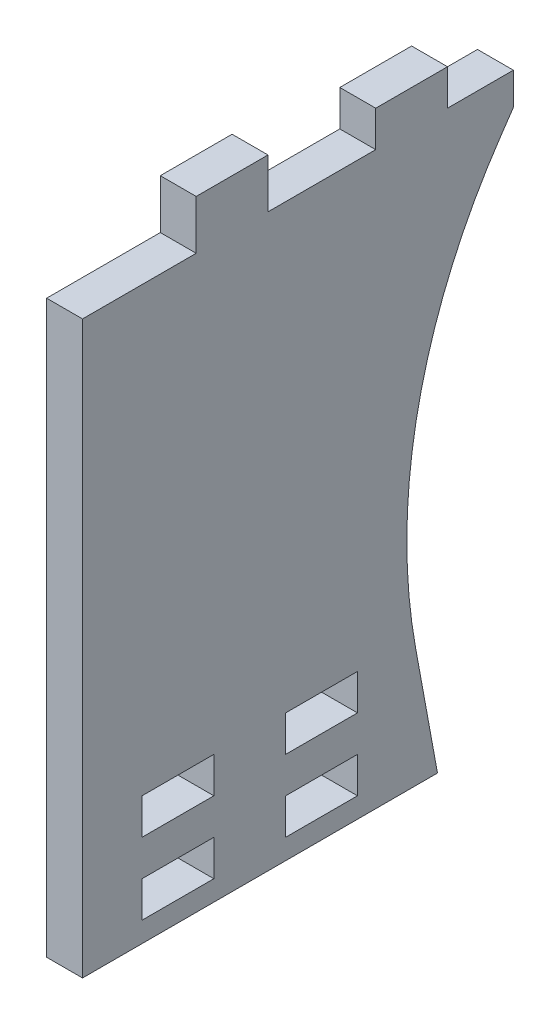
ISO-10303-21;
HEADER;
FILE_DESCRIPTION(('STEP AP214'),'2;1');
FILE_NAME('part.step','',(''),(''),'','','');
FILE_SCHEMA(('AUTOMOTIVE_DESIGN { 1 0 10303 214 1 1 1 1 }'));
ENDSEC;
DATA;
#1=APPLICATION_CONTEXT('core data for automotive mechanical design processes');
#2=APPLICATION_PROTOCOL_DEFINITION('international standard','automotive_design',2000,#1);
#3=PRODUCT_CONTEXT('',#1,'mechanical');
#4=PRODUCT('Part','Part','',(#3));
#5=PRODUCT_RELATED_PRODUCT_CATEGORY('part','',(#4));
#6=PRODUCT_DEFINITION_FORMATION('','',#4);
#7=PRODUCT_DEFINITION_CONTEXT('part definition',#1,'design');
#8=PRODUCT_DEFINITION('design','',#6,#7);
#9=PRODUCT_DEFINITION_SHAPE('','',#8);
#10=(LENGTH_UNIT() NAMED_UNIT(*) SI_UNIT(.MILLI.,.METRE.));
#11=(NAMED_UNIT(*) PLANE_ANGLE_UNIT() SI_UNIT($,.RADIAN.));
#12=(NAMED_UNIT(*) SI_UNIT($,.STERADIAN.) SOLID_ANGLE_UNIT());
#13=UNCERTAINTY_MEASURE_WITH_UNIT(LENGTH_MEASURE(1.E-05),#10,'distance_accuracy_value','');
#14=(GEOMETRIC_REPRESENTATION_CONTEXT(3) GLOBAL_UNCERTAINTY_ASSIGNED_CONTEXT((#13)) GLOBAL_UNIT_ASSIGNED_CONTEXT((#10,
#11,#12)) REPRESENTATION_CONTEXT('',''));
#15=CARTESIAN_POINT('',(0.,0.,0.));
#16=DIRECTION('',(0.,0.,1.));
#17=DIRECTION('',(1.,0.,0.));
#18=AXIS2_PLACEMENT_3D('',#15,#16,#17);
#19=CARTESIAN_POINT('',(6.,-48.8702368334802,-124.383621935254));
#20=DIRECTION('',(1.,0.,0.));
#21=DIRECTION('',(0.,0.,-1.));
#22=AXIS2_PLACEMENT_3D('',#19,#20,#21);
#23=PLANE('',#22);
#24=DIRECTION('',(0.,0.,-1.));
#25=VECTOR('',#24,1.);
#26=CARTESIAN_POINT('',(6.,-69.5861371385895,9.86311586080989));
#27=LINE('',#26,#25);
#28=CARTESIAN_POINT('',(6.,-69.5861371385895,9.86311586080989));
#29=VERTEX_POINT('',#28);
#30=CARTESIAN_POINT('',(6.,-69.5861371385895,-2.13688413919011));
#31=VERTEX_POINT('',#30);
#32=EDGE_CURVE('E276',#29,#31,#27,.T.);
#33=ORIENTED_EDGE('',*,*,#32,.F.);
#34=DIRECTION('',(0.,-1.,0.));
#35=VECTOR('',#34,1.);
#36=CARTESIAN_POINT('',(6.,-63.5861371385895,9.86311586080989));
#37=LINE('',#36,#35);
#38=CARTESIAN_POINT('',(6.,-63.5861371385895,9.86311586080989));
#39=VERTEX_POINT('',#38);
#40=EDGE_CURVE('E274',#39,#29,#37,.T.);
#41=ORIENTED_EDGE('',*,*,#40,.F.);
#42=DIRECTION('',(0.,0.,1.));
#43=VECTOR('',#42,1.);
#44=CARTESIAN_POINT('',(6.,-63.5861371385895,9.86311586080989));
#45=LINE('',#44,#43);
#46=CARTESIAN_POINT('',(6.,-63.5861371385895,-2.13688413919011));
#47=VERTEX_POINT('',#46);
#48=EDGE_CURVE('E282',#47,#39,#45,.T.);
#49=ORIENTED_EDGE('',*,*,#48,.F.);
#50=DIRECTION('',(0.,1.,0.));
#51=VECTOR('',#50,1.);
#52=CARTESIAN_POINT('',(6.,-63.5861371385895,-2.13688413919011));
#53=LINE('',#52,#51);
#54=EDGE_CURVE('E279',#31,#47,#53,.T.);
#55=ORIENTED_EDGE('',*,*,#54,.F.);
#56=EDGE_LOOP('',(#33,#41,#49,#55));
#57=FACE_BOUND('',#56,.T.);
#58=DIRECTION('',(0.,0.,-1.));
#59=VECTOR('',#58,1.);
#60=CARTESIAN_POINT('',(6.,-81.5861371385895,9.86311586080989));
#61=LINE('',#60,#59);
#62=CARTESIAN_POINT('',(6.,-81.5861371385895,9.86311586080989));
#63=VERTEX_POINT('',#62);
#64=CARTESIAN_POINT('',(6.,-81.5861371385895,-2.13688413919011));
#65=VERTEX_POINT('',#64);
#66=EDGE_CURVE('E338',#63,#65,#61,.T.);
#67=ORIENTED_EDGE('',*,*,#66,.F.);
#68=DIRECTION('',(0.,-1.,0.));
#69=VECTOR('',#68,1.);
#70=CARTESIAN_POINT('',(6.,-75.5861371385895,9.86311586080989));
#71=LINE('',#70,#69);
#72=CARTESIAN_POINT('',(6.,-75.5861371385895,9.86311586080989));
#73=VERTEX_POINT('',#72);
#74=EDGE_CURVE('E336',#73,#63,#71,.T.);
#75=ORIENTED_EDGE('',*,*,#74,.F.);
#76=DIRECTION('',(0.,0.,1.));
#77=VECTOR('',#76,1.);
#78=CARTESIAN_POINT('',(6.,-75.5861371385895,9.86311586080989));
#79=LINE('',#78,#77);
#80=CARTESIAN_POINT('',(6.,-75.5861371385895,-2.13688413919011));
#81=VERTEX_POINT('',#80);
#82=EDGE_CURVE('E344',#81,#73,#79,.T.);
#83=ORIENTED_EDGE('',*,*,#82,.F.);
#84=DIRECTION('',(0.,1.,0.));
#85=VECTOR('',#84,1.);
#86=CARTESIAN_POINT('',(6.,-75.5861371385895,-2.13688413919011));
#87=LINE('',#86,#85);
#88=EDGE_CURVE('E341',#65,#81,#87,.T.);
#89=ORIENTED_EDGE('',*,*,#88,.F.);
#90=EDGE_LOOP('',(#67,#75,#83,#89));
#91=FACE_BOUND('',#90,.T.);
#92=DIRECTION('',(0.,0.,1.));
#93=VECTOR('',#92,1.);
#94=CARTESIAN_POINT('',(6.,10.4051088489599,19.8097762628617));
#95=LINE('',#94,#93);
#96=CARTESIAN_POINT('',(6.,10.4051088489599,0.815811952861727));
#97=VERTEX_POINT('',#96);
#98=CARTESIAN_POINT('',(6.,10.4051088489599,19.8097762628617));
#99=VERTEX_POINT('',#98);
#100=EDGE_CURVE('E367',#97,#99,#95,.T.);
#101=ORIENTED_EDGE('',*,*,#100,.T.);
#102=DIRECTION('',(0.,-1.,0.));
#103=VECTOR('',#102,1.);
#104=CARTESIAN_POINT('',(6.,10.4051088489599,19.8097762628617));
#105=LINE('',#104,#103);
#106=CARTESIAN_POINT('',(6.,-84.9803808195255,19.8097762628617));
#107=VERTEX_POINT('',#106);
#108=EDGE_CURVE('E370',#99,#107,#105,.T.);
#109=ORIENTED_EDGE('',*,*,#108,.T.);
#110=DIRECTION('',(0.,0.,-1.));
#111=VECTOR('',#110,1.);
#112=CARTESIAN_POINT('',(6.,-84.9803808195255,19.8097762628617));
#113=LINE('',#112,#111);
#114=CARTESIAN_POINT('',(6.,-84.9803808195255,-39.5079732572395));
#115=VERTEX_POINT('',#114);
#116=EDGE_CURVE('E373',#107,#115,#113,.T.);
#117=ORIENTED_EDGE('',*,*,#116,.T.);
#118=DIRECTION('',(0.,0.983570031032781,0.180526989821952));
#119=VECTOR('',#118,1.);
#120=CARTESIAN_POINT('',(6.,-65.1176659174562,-35.8623191423037));
#121=LINE('',#120,#119);
#122=CARTESIAN_POINT('',(6.,-65.1176659174562,-35.8623191423037));
#123=VERTEX_POINT('',#122);
#124=EDGE_CURVE('E375',#115,#123,#121,.T.);
#125=ORIENTED_EDGE('',*,*,#124,.T.);
#126=CARTESIAN_POINT('',(6.,-48.8702368334802,-124.383621935254));
#127=DIRECTION('',(-1.,0.,0.));
#128=DIRECTION('',(0.,0.,-1.));
#129=AXIS2_PLACEMENT_3D('',#126,#127,#128);
#130=CIRCLE('',#129,90.);
#131=CARTESIAN_POINT('',(6.,1.83089749925273,-50.0237202585157));
#132=VERTEX_POINT('',#131);
#133=EDGE_CURVE('E377',#123,#132,#130,.T.);
#134=ORIENTED_EDGE('',*,*,#133,.T.);
#135=DIRECTION('',(0.,0.826221129741537,-0.563345937030363));
#136=VECTOR('',#135,1.);
#137=CARTESIAN_POINT('',(6.,5.00836064229487,-52.1902237371383));
#138=LINE('',#137,#136);
#139=CARTESIAN_POINT('',(6.,5.00836064229487,-52.1902237371383));
#140=VERTEX_POINT('',#139);
#141=EDGE_CURVE('E379',#132,#140,#138,.T.);
#142=ORIENTED_EDGE('',*,*,#141,.T.);
#143=DIRECTION('',(0.,1.,0.));
#144=VECTOR('',#143,1.);
#145=CARTESIAN_POINT('',(6.,5.00836064229487,-52.1902237371383));
#146=LINE('',#145,#144);
#147=CARTESIAN_POINT('',(6.,10.4051088489599,-52.1902237371383));
#148=VERTEX_POINT('',#147);
#149=EDGE_CURVE('E381',#140,#148,#146,.T.);
#150=ORIENTED_EDGE('',*,*,#149,.T.);
#151=DIRECTION('',(0.,0.,1.));
#152=VECTOR('',#151,1.);
#153=CARTESIAN_POINT('',(6.,10.4051088489599,-41.1841880471383));
#154=LINE('',#153,#152);
#155=CARTESIAN_POINT('',(6.,10.4051088489599,-41.1841880471383));
#156=VERTEX_POINT('',#155);
#157=EDGE_CURVE('E383',#148,#156,#154,.T.);
#158=ORIENTED_EDGE('',*,*,#157,.T.);
#159=DIRECTION('',(0.,1.,0.));
#160=VECTOR('',#159,1.);
#161=CARTESIAN_POINT('',(6.,16.4051088489599,-41.1841880471383));
#162=LINE('',#161,#160);
#163=CARTESIAN_POINT('',(6.,16.4051088489599,-41.1841880471383));
#164=VERTEX_POINT('',#163);
#165=EDGE_CURVE('E385',#156,#164,#162,.T.);
#166=ORIENTED_EDGE('',*,*,#165,.T.);
#167=DIRECTION('',(0.,0.,1.));
#168=VECTOR('',#167,1.);
#169=CARTESIAN_POINT('',(6.,16.4051088489599,-29.1841880471383));
#170=LINE('',#169,#168);
#171=CARTESIAN_POINT('',(6.,16.4051088489599,-29.1841880471383));
#172=VERTEX_POINT('',#171);
#173=EDGE_CURVE('E387',#164,#172,#170,.T.);
#174=ORIENTED_EDGE('',*,*,#173,.T.);
#175=DIRECTION('',(0.,-1.,0.));
#176=VECTOR('',#175,1.);
#177=CARTESIAN_POINT('',(6.,10.4051088489599,-29.1841880471383));
#178=LINE('',#177,#176);
#179=CARTESIAN_POINT('',(6.,10.4051088489599,-29.1841880471383));
#180=VERTEX_POINT('',#179);
#181=EDGE_CURVE('E389',#172,#180,#178,.T.);
#182=ORIENTED_EDGE('',*,*,#181,.T.);
#183=DIRECTION('',(0.,0.,1.));
#184=VECTOR('',#183,1.);
#185=CARTESIAN_POINT('',(6.,10.4051088489599,-11.1841880471383));
#186=LINE('',#185,#184);
#187=CARTESIAN_POINT('',(6.,10.4051088489599,-11.1841880471383));
#188=VERTEX_POINT('',#187);
#189=EDGE_CURVE('E391',#180,#188,#186,.T.);
#190=ORIENTED_EDGE('',*,*,#189,.T.);
#191=DIRECTION('',(0.,1.,0.));
#192=VECTOR('',#191,1.);
#193=CARTESIAN_POINT('',(6.,18.6369845499627,-11.1841880471383));
#194=LINE('',#193,#192);
#195=CARTESIAN_POINT('',(6.,18.6369845499627,-11.1841880471383));
#196=VERTEX_POINT('',#195);
#197=EDGE_CURVE('E393',#188,#196,#194,.T.);
#198=ORIENTED_EDGE('',*,*,#197,.T.);
#199=DIRECTION('',(0.,0.,1.));
#200=VECTOR('',#199,1.);
#201=CARTESIAN_POINT('',(6.,18.6369845499627,0.815811952861727));
#202=LINE('',#201,#200);
#203=CARTESIAN_POINT('',(6.,18.6369845499627,0.815811952861727));
#204=VERTEX_POINT('',#203);
#205=EDGE_CURVE('E395',#196,#204,#202,.T.);
#206=ORIENTED_EDGE('',*,*,#205,.T.);
#207=DIRECTION('',(0.,-1.,0.));
#208=VECTOR('',#207,1.);
#209=CARTESIAN_POINT('',(6.,10.4051088489599,0.815811952861727));
#210=LINE('',#209,#208);
#211=EDGE_CURVE('E397',#204,#97,#210,.T.);
#212=ORIENTED_EDGE('',*,*,#211,.T.);
#213=EDGE_LOOP('',(#101,#109,#117,#125,#134,#142,#150,#158,#166,#174,#182,#190,#198,#206,#212));
#214=FACE_BOUND('',#213,.T.);
#215=DIRECTION('',(0.,0.,-1.));
#216=VECTOR('',#215,1.);
#217=CARTESIAN_POINT('',(6.,-81.5861371385895,-14.1368841391901));
#218=LINE('',#217,#216);
#219=CARTESIAN_POINT('',(6.,-81.5861371385895,-14.1368841391901));
#220=VERTEX_POINT('',#219);
#221=CARTESIAN_POINT('',(6.,-81.5861371385895,-26.1368841391901));
#222=VERTEX_POINT('',#221);
#223=EDGE_CURVE('E307',#220,#222,#218,.T.);
#224=ORIENTED_EDGE('',*,*,#223,.F.);
#225=DIRECTION('',(0.,-1.,0.));
#226=VECTOR('',#225,1.);
#227=CARTESIAN_POINT('',(6.,-75.5861371385895,-14.1368841391901));
#228=LINE('',#227,#226);
#229=CARTESIAN_POINT('',(6.,-75.5861371385895,-14.1368841391901));
#230=VERTEX_POINT('',#229);
#231=EDGE_CURVE('E305',#230,#220,#228,.T.);
#232=ORIENTED_EDGE('',*,*,#231,.F.);
#233=DIRECTION('',(0.,0.,1.));
#234=VECTOR('',#233,1.);
#235=CARTESIAN_POINT('',(6.,-75.5861371385895,-14.1368841391901));
#236=LINE('',#235,#234);
#237=CARTESIAN_POINT('',(6.,-75.5861371385895,-26.1368841391901));
#238=VERTEX_POINT('',#237);
#239=EDGE_CURVE('E313',#238,#230,#236,.T.);
#240=ORIENTED_EDGE('',*,*,#239,.F.);
#241=DIRECTION('',(0.,1.,0.));
#242=VECTOR('',#241,1.);
#243=CARTESIAN_POINT('',(6.,-75.5861371385895,-26.1368841391901));
#244=LINE('',#243,#242);
#245=EDGE_CURVE('E310',#222,#238,#244,.T.);
#246=ORIENTED_EDGE('',*,*,#245,.F.);
#247=EDGE_LOOP('',(#224,#232,#240,#246));
#248=FACE_BOUND('',#247,.T.);
#249=DIRECTION('',(0.,0.,-1.));
#250=VECTOR('',#249,1.);
#251=CARTESIAN_POINT('',(6.,-69.5861371385895,-14.1368841391901));
#252=LINE('',#251,#250);
#253=CARTESIAN_POINT('',(6.,-69.5861371385895,-14.1368841391901));
#254=VERTEX_POINT('',#253);
#255=CARTESIAN_POINT('',(6.,-69.5861371385895,-26.1368841391901));
#256=VERTEX_POINT('',#255);
#257=EDGE_CURVE('E246',#254,#256,#252,.T.);
#258=ORIENTED_EDGE('',*,*,#257,.F.);
#259=DIRECTION('',(0.,-1.,0.));
#260=VECTOR('',#259,1.);
#261=CARTESIAN_POINT('',(6.,-63.5861371385895,-14.1368841391901));
#262=LINE('',#261,#260);
#263=CARTESIAN_POINT('',(6.,-63.5861371385895,-14.1368841391901));
#264=VERTEX_POINT('',#263);
#265=EDGE_CURVE('E238',#264,#254,#262,.T.);
#266=ORIENTED_EDGE('',*,*,#265,.F.);
#267=DIRECTION('',(0.,0.,1.));
#268=VECTOR('',#267,1.);
#269=CARTESIAN_POINT('',(6.,-63.5861371385895,-14.1368841391901));
#270=LINE('',#269,#268);
#271=CARTESIAN_POINT('',(6.,-63.5861371385895,-26.1368841391901));
#272=VERTEX_POINT('',#271);
#273=EDGE_CURVE('E260',#272,#264,#270,.T.);
#274=ORIENTED_EDGE('',*,*,#273,.F.);
#275=DIRECTION('',(0.,1.,0.));
#276=VECTOR('',#275,1.);
#277=CARTESIAN_POINT('',(6.,-63.5861371385895,-26.1368841391901));
#278=LINE('',#277,#276);
#279=EDGE_CURVE('E258',#256,#272,#278,.T.);
#280=ORIENTED_EDGE('',*,*,#279,.F.);
#281=EDGE_LOOP('',(#258,#266,#274,#280));
#282=FACE_BOUND('',#281,.T.);
#283=ADVANCED_FACE('F35',(#57,#91,#214,#248,#282),#23,.T.);
#284=CARTESIAN_POINT('',(0.,-48.8702368334802,-124.383621935254));
#285=DIRECTION('',(1.,0.,0.));
#286=DIRECTION('',(0.,0.,-1.));
#287=AXIS2_PLACEMENT_3D('',#284,#285,#286);
#288=PLANE('',#287);
#289=DIRECTION('',(0.,-1.,0.));
#290=VECTOR('',#289,1.);
#291=CARTESIAN_POINT('',(0.,-63.5861371385895,9.86311586080989));
#292=LINE('',#291,#290);
#293=CARTESIAN_POINT('',(0.,-63.5861371385895,9.8631158608099));
#294=VERTEX_POINT('',#293);
#295=CARTESIAN_POINT('',(0.,-69.5861371385895,9.86311586080989));
#296=VERTEX_POINT('',#295);
#297=EDGE_CURVE('E254',#294,#296,#292,.T.);
#298=ORIENTED_EDGE('',*,*,#297,.T.);
#299=DIRECTION('',(0.,0.,-1.));
#300=VECTOR('',#299,1.);
#301=CARTESIAN_POINT('',(0.,-69.5861371385895,9.86311586080989));
#302=LINE('',#301,#300);
#303=CARTESIAN_POINT('',(0.,-69.5861371385895,-2.13688413919011));
#304=VERTEX_POINT('',#303);
#305=EDGE_CURVE('E287',#296,#304,#302,.T.);
#306=ORIENTED_EDGE('',*,*,#305,.T.);
#307=DIRECTION('',(0.,1.,0.));
#308=VECTOR('',#307,1.);
#309=CARTESIAN_POINT('',(0.,-63.5861371385895,-2.13688413919011));
#310=LINE('',#309,#308);
#311=CARTESIAN_POINT('',(0.,-63.5861371385895,-2.13688413919011));
#312=VERTEX_POINT('',#311);
#313=EDGE_CURVE('E290',#304,#312,#310,.T.);
#314=ORIENTED_EDGE('',*,*,#313,.T.);
#315=DIRECTION('',(0.,0.,1.));
#316=VECTOR('',#315,1.);
#317=CARTESIAN_POINT('',(0.,-63.5861371385895,9.86311586080989));
#318=LINE('',#317,#316);
#319=EDGE_CURVE('E277',#312,#294,#318,.T.);
#320=ORIENTED_EDGE('',*,*,#319,.T.);
#321=EDGE_LOOP('',(#298,#306,#314,#320));
#322=FACE_BOUND('',#321,.T.);
#323=DIRECTION('',(0.,-1.,0.));
#324=VECTOR('',#323,1.);
#325=CARTESIAN_POINT('',(0.,-75.5861371385895,9.86311586080989));
#326=LINE('',#325,#324);
#327=CARTESIAN_POINT('',(0.,-75.5861371385895,9.86311586080987));
#328=VERTEX_POINT('',#327);
#329=CARTESIAN_POINT('',(0.,-81.5861371385895,9.86311586080989));
#330=VERTEX_POINT('',#329);
#331=EDGE_CURVE('E335',#328,#330,#326,.T.);
#332=ORIENTED_EDGE('',*,*,#331,.T.);
#333=DIRECTION('',(0.,0.,-1.));
#334=VECTOR('',#333,1.);
#335=CARTESIAN_POINT('',(0.,-81.5861371385895,9.86311586080989));
#336=LINE('',#335,#334);
#337=CARTESIAN_POINT('',(0.,-81.5861371385895,-2.13688413919011));
#338=VERTEX_POINT('',#337);
#339=EDGE_CURVE('E349',#330,#338,#336,.T.);
#340=ORIENTED_EDGE('',*,*,#339,.T.);
#341=DIRECTION('',(0.,1.,0.));
#342=VECTOR('',#341,1.);
#343=CARTESIAN_POINT('',(0.,-75.5861371385895,-2.13688413919011));
#344=LINE('',#343,#342);
#345=CARTESIAN_POINT('',(0.,-75.5861371385895,-2.13688413919011));
#346=VERTEX_POINT('',#345);
#347=EDGE_CURVE('E352',#338,#346,#344,.T.);
#348=ORIENTED_EDGE('',*,*,#347,.T.);
#349=DIRECTION('',(0.,0.,1.));
#350=VECTOR('',#349,1.);
#351=CARTESIAN_POINT('',(0.,-75.5861371385895,9.86311586080989));
#352=LINE('',#351,#350);
#353=EDGE_CURVE('E339',#346,#328,#352,.T.);
#354=ORIENTED_EDGE('',*,*,#353,.T.);
#355=EDGE_LOOP('',(#332,#340,#348,#354));
#356=FACE_BOUND('',#355,.T.);
#357=DIRECTION('',(0.,0.,1.));
#358=VECTOR('',#357,1.);
#359=CARTESIAN_POINT('',(0.,10.4051088489599,19.8097762628617));
#360=LINE('',#359,#358);
#361=CARTESIAN_POINT('',(0.,10.4051088489599,0.815811952861727));
#362=VERTEX_POINT('',#361);
#363=CARTESIAN_POINT('',(0.,10.4051088489599,19.8097762628617));
#364=VERTEX_POINT('',#363);
#365=EDGE_CURVE('E366',#362,#364,#360,.T.);
#366=ORIENTED_EDGE('',*,*,#365,.F.);
#367=DIRECTION('',(0.,-1.,0.));
#368=VECTOR('',#367,1.);
#369=CARTESIAN_POINT('',(0.,10.4051088489599,0.815811952861727));
#370=LINE('',#369,#368);
#371=CARTESIAN_POINT('',(0.,18.6369845499627,0.815811952861727));
#372=VERTEX_POINT('',#371);
#373=EDGE_CURVE('E371',#372,#362,#370,.T.);
#374=ORIENTED_EDGE('',*,*,#373,.F.);
#375=DIRECTION('',(0.,0.,1.));
#376=VECTOR('',#375,1.);
#377=CARTESIAN_POINT('',(0.,18.6369845499627,0.815811952861727));
#378=LINE('',#377,#376);
#379=CARTESIAN_POINT('',(0.,18.6369845499627,-11.1841880471383));
#380=VERTEX_POINT('',#379);
#381=EDGE_CURVE('E426',#380,#372,#378,.T.);
#382=ORIENTED_EDGE('',*,*,#381,.F.);
#383=DIRECTION('',(0.,1.,0.));
#384=VECTOR('',#383,1.);
#385=CARTESIAN_POINT('',(0.,18.6369845499627,-11.1841880471383));
#386=LINE('',#385,#384);
#387=CARTESIAN_POINT('',(0.,10.4051088489599,-11.1841880471383));
#388=VERTEX_POINT('',#387);
#389=EDGE_CURVE('E424',#388,#380,#386,.T.);
#390=ORIENTED_EDGE('',*,*,#389,.F.);
#391=DIRECTION('',(0.,0.,1.));
#392=VECTOR('',#391,1.);
#393=CARTESIAN_POINT('',(0.,10.4051088489599,-11.1841880471383));
#394=LINE('',#393,#392);
#395=CARTESIAN_POINT('',(0.,10.4051088489599,-29.1841880471383));
#396=VERTEX_POINT('',#395);
#397=EDGE_CURVE('E422',#396,#388,#394,.T.);
#398=ORIENTED_EDGE('',*,*,#397,.F.);
#399=DIRECTION('',(0.,-1.,0.));
#400=VECTOR('',#399,1.);
#401=CARTESIAN_POINT('',(0.,10.4051088489599,-29.1841880471383));
#402=LINE('',#401,#400);
#403=CARTESIAN_POINT('',(0.,16.4051088489599,-29.1841880471383));
#404=VERTEX_POINT('',#403);
#405=EDGE_CURVE('E420',#404,#396,#402,.T.);
#406=ORIENTED_EDGE('',*,*,#405,.F.);
#407=DIRECTION('',(0.,0.,1.));
#408=VECTOR('',#407,1.);
#409=CARTESIAN_POINT('',(0.,16.4051088489599,-29.1841880471383));
#410=LINE('',#409,#408);
#411=CARTESIAN_POINT('',(0.,16.4051088489599,-41.1841880471383));
#412=VERTEX_POINT('',#411);
#413=EDGE_CURVE('E418',#412,#404,#410,.T.);
#414=ORIENTED_EDGE('',*,*,#413,.F.);
#415=DIRECTION('',(0.,1.,0.));
#416=VECTOR('',#415,1.);
#417=CARTESIAN_POINT('',(0.,16.4051088489599,-41.1841880471383));
#418=LINE('',#417,#416);
#419=CARTESIAN_POINT('',(0.,10.4051088489599,-41.1841880471383));
#420=VERTEX_POINT('',#419);
#421=EDGE_CURVE('E416',#420,#412,#418,.T.);
#422=ORIENTED_EDGE('',*,*,#421,.F.);
#423=DIRECTION('',(0.,0.,1.));
#424=VECTOR('',#423,1.);
#425=CARTESIAN_POINT('',(0.,10.4051088489599,-41.1841880471383));
#426=LINE('',#425,#424);
#427=CARTESIAN_POINT('',(0.,10.4051088489599,-52.1902237371383));
#428=VERTEX_POINT('',#427);
#429=EDGE_CURVE('E414',#428,#420,#426,.T.);
#430=ORIENTED_EDGE('',*,*,#429,.F.);
#431=DIRECTION('',(0.,1.,0.));
#432=VECTOR('',#431,1.);
#433=CARTESIAN_POINT('',(0.,5.00836064229487,-52.1902237371383));
#434=LINE('',#433,#432);
#435=CARTESIAN_POINT('',(0.,5.00836064229487,-52.1902237371383));
#436=VERTEX_POINT('',#435);
#437=EDGE_CURVE('E412',#436,#428,#434,.T.);
#438=ORIENTED_EDGE('',*,*,#437,.F.);
#439=DIRECTION('',(0.,0.826221129741537,-0.563345937030363));
#440=VECTOR('',#439,1.);
#441=CARTESIAN_POINT('',(0.,5.00836064229487,-52.1902237371383));
#442=LINE('',#441,#440);
#443=CARTESIAN_POINT('',(0.,1.83089749925273,-50.0237202585157));
#444=VERTEX_POINT('',#443);
#445=EDGE_CURVE('E410',#444,#436,#442,.T.);
#446=ORIENTED_EDGE('',*,*,#445,.F.);
#447=CARTESIAN_POINT('',(0.,-48.8702368334802,-124.383621935254));
#448=DIRECTION('',(-1.,0.,0.));
#449=DIRECTION('',(0.,0.,-1.));
#450=AXIS2_PLACEMENT_3D('',#447,#448,#449);
#451=CIRCLE('',#450,90.);
#452=CARTESIAN_POINT('',(0.,-65.1176659174562,-35.8623191423037));
#453=VERTEX_POINT('',#452);
#454=EDGE_CURVE('E408',#453,#444,#451,.T.);
#455=ORIENTED_EDGE('',*,*,#454,.F.);
#456=DIRECTION('',(0.,0.983570031032781,0.180526989821952));
#457=VECTOR('',#456,1.);
#458=CARTESIAN_POINT('',(0.,-65.1176659174562,-35.8623191423037));
#459=LINE('',#458,#457);
#460=CARTESIAN_POINT('',(0.,-84.9803808195255,-39.5079732572395));
#461=VERTEX_POINT('',#460);
#462=EDGE_CURVE('E406',#461,#453,#459,.T.);
#463=ORIENTED_EDGE('',*,*,#462,.F.);
#464=DIRECTION('',(0.,0.,-1.));
#465=VECTOR('',#464,1.);
#466=CARTESIAN_POINT('',(0.,-84.9803808195255,19.8097762628617));
#467=LINE('',#466,#465);
#468=CARTESIAN_POINT('',(0.,-84.9803808195255,19.8097762628617));
#469=VERTEX_POINT('',#468);
#470=EDGE_CURVE('E404',#469,#461,#467,.T.);
#471=ORIENTED_EDGE('',*,*,#470,.F.);
#472=DIRECTION('',(0.,-1.,0.));
#473=VECTOR('',#472,1.);
#474=CARTESIAN_POINT('',(0.,10.4051088489599,19.8097762628617));
#475=LINE('',#474,#473);
#476=EDGE_CURVE('E402',#364,#469,#475,.T.);
#477=ORIENTED_EDGE('',*,*,#476,.F.);
#478=EDGE_LOOP('',(#366,#374,#382,#390,#398,#406,#414,#422,#430,#438,#446,#455,#463,#471,#477));
#479=FACE_BOUND('',#478,.T.);
#480=DIRECTION('',(0.,-1.,0.));
#481=VECTOR('',#480,1.);
#482=CARTESIAN_POINT('',(0.,-75.5861371385895,-14.1368841391901));
#483=LINE('',#482,#481);
#484=CARTESIAN_POINT('',(0.,-75.5861371385895,-14.1368841391901));
#485=VERTEX_POINT('',#484);
#486=CARTESIAN_POINT('',(0.,-81.5861371385895,-14.1368841391901));
#487=VERTEX_POINT('',#486);
#488=EDGE_CURVE('E304',#485,#487,#483,.T.);
#489=ORIENTED_EDGE('',*,*,#488,.T.);
#490=DIRECTION('',(0.,0.,-1.));
#491=VECTOR('',#490,1.);
#492=CARTESIAN_POINT('',(0.,-81.5861371385895,-14.1368841391901));
#493=LINE('',#492,#491);
#494=CARTESIAN_POINT('',(0.,-81.5861371385895,-26.1368841391901));
#495=VERTEX_POINT('',#494);
#496=EDGE_CURVE('E318',#487,#495,#493,.T.);
#497=ORIENTED_EDGE('',*,*,#496,.T.);
#498=DIRECTION('',(0.,1.,0.));
#499=VECTOR('',#498,1.);
#500=CARTESIAN_POINT('',(0.,-75.5861371385895,-26.1368841391901));
#501=LINE('',#500,#499);
#502=CARTESIAN_POINT('',(0.,-75.5861371385895,-26.1368841391901));
#503=VERTEX_POINT('',#502);
#504=EDGE_CURVE('E321',#495,#503,#501,.T.);
#505=ORIENTED_EDGE('',*,*,#504,.T.);
#506=DIRECTION('',(0.,0.,1.));
#507=VECTOR('',#506,1.);
#508=CARTESIAN_POINT('',(0.,-75.5861371385895,-14.1368841391901));
#509=LINE('',#508,#507);
#510=EDGE_CURVE('E308',#503,#485,#509,.T.);
#511=ORIENTED_EDGE('',*,*,#510,.T.);
#512=EDGE_LOOP('',(#489,#497,#505,#511));
#513=FACE_BOUND('',#512,.T.);
#514=DIRECTION('',(0.,-1.,0.));
#515=VECTOR('',#514,1.);
#516=CARTESIAN_POINT('',(0.,-63.5861371385895,-14.1368841391901));
#517=LINE('',#516,#515);
#518=CARTESIAN_POINT('',(0.,-63.5861371385895,-14.1368841391901));
#519=VERTEX_POINT('',#518);
#520=CARTESIAN_POINT('',(0.,-69.5861371385895,-14.1368841391901));
#521=VERTEX_POINT('',#520);
#522=EDGE_CURVE('E58',#519,#521,#517,.T.);
#523=ORIENTED_EDGE('',*,*,#522,.T.);
#524=DIRECTION('',(0.,0.,-1.));
#525=VECTOR('',#524,1.);
#526=CARTESIAN_POINT('',(0.,-69.5861371385895,-14.1368841391901));
#527=LINE('',#526,#525);
#528=CARTESIAN_POINT('',(0.,-69.5861371385895,-26.1368841391901));
#529=VERTEX_POINT('',#528);
#530=EDGE_CURVE('E253',#521,#529,#527,.T.);
#531=ORIENTED_EDGE('',*,*,#530,.T.);
#532=DIRECTION('',(0.,1.,0.));
#533=VECTOR('',#532,1.);
#534=CARTESIAN_POINT('',(0.,-63.5861371385895,-26.1368841391901));
#535=LINE('',#534,#533);
#536=CARTESIAN_POINT('',(0.,-63.5861371385895,-26.1368841391901));
#537=VERTEX_POINT('',#536);
#538=EDGE_CURVE('E266',#529,#537,#535,.T.);
#539=ORIENTED_EDGE('',*,*,#538,.T.);
#540=DIRECTION('',(0.,0.,1.));
#541=VECTOR('',#540,1.);
#542=CARTESIAN_POINT('',(0.,-63.5861371385895,-14.1368841391901));
#543=LINE('',#542,#541);
#544=EDGE_CURVE('E247',#537,#519,#543,.T.);
#545=ORIENTED_EDGE('',*,*,#544,.T.);
#546=EDGE_LOOP('',(#523,#531,#539,#545));
#547=FACE_BOUND('',#546,.T.);
#548=ADVANCED_FACE('F477',(#322,#356,#479,#513,#547),#288,.F.);
#549=CARTESIAN_POINT('',(6.,10.4051088489599,19.8097762628617));
#550=DIRECTION('',(0.,-1.,0.));
#551=DIRECTION('',(0.,0.,-1.));
#552=AXIS2_PLACEMENT_3D('',#549,#550,#551);
#553=PLANE('',#552);
#554=ORIENTED_EDGE('',*,*,#365,.T.);
#555=DIRECTION('',(-1.,0.,0.));
#556=VECTOR('',#555,1.);
#557=CARTESIAN_POINT('',(6.,10.4051088489599,19.8097762628617));
#558=LINE('',#557,#556);
#559=EDGE_CURVE('E11',#99,#364,#558,.T.);
#560=ORIENTED_EDGE('',*,*,#559,.F.);
#561=ORIENTED_EDGE('',*,*,#100,.F.);
#562=DIRECTION('',(-1.,0.,0.));
#563=VECTOR('',#562,1.);
#564=CARTESIAN_POINT('',(6.,10.4051088489599,0.815811952861727));
#565=LINE('',#564,#563);
#566=EDGE_CURVE('E399',#97,#362,#565,.T.);
#567=ORIENTED_EDGE('',*,*,#566,.T.);
#568=EDGE_LOOP('',(#554,#560,#561,#567));
#569=FACE_BOUND('',#568,.T.);
#570=ADVANCED_FACE('F37',(#569),#553,.F.);
#571=CARTESIAN_POINT('',(6.,10.4051088489599,19.8097762628617));
#572=DIRECTION('',(0.,0.,-1.));
#573=DIRECTION('',(0.,1.,0.));
#574=AXIS2_PLACEMENT_3D('',#571,#572,#573);
#575=PLANE('',#574);
#576=ORIENTED_EDGE('',*,*,#476,.T.);
#577=DIRECTION('',(-1.,0.,0.));
#578=VECTOR('',#577,1.);
#579=CARTESIAN_POINT('',(6.,-84.9803808195255,19.8097762628617));
#580=LINE('',#579,#578);
#581=EDGE_CURVE('E43',#107,#469,#580,.T.);
#582=ORIENTED_EDGE('',*,*,#581,.F.);
#583=ORIENTED_EDGE('',*,*,#108,.F.);
#584=ORIENTED_EDGE('',*,*,#559,.T.);
#585=EDGE_LOOP('',(#576,#582,#583,#584));
#586=FACE_BOUND('',#585,.T.);
#587=ADVANCED_FACE('F495',(#586),#575,.F.);
#588=CARTESIAN_POINT('',(6.,-84.9803808195255,19.8097762628617));
#589=DIRECTION('',(0.,1.,0.));
#590=DIRECTION('',(0.,0.,1.));
#591=AXIS2_PLACEMENT_3D('',#588,#589,#590);
#592=PLANE('',#591);
#593=ORIENTED_EDGE('',*,*,#470,.T.);
#594=DIRECTION('',(-1.,0.,0.));
#595=VECTOR('',#594,1.);
#596=CARTESIAN_POINT('',(6.,-84.9803808195255,-39.5079732572395));
#597=LINE('',#596,#595);
#598=EDGE_CURVE('E464',#115,#461,#597,.T.);
#599=ORIENTED_EDGE('',*,*,#598,.F.);
#600=ORIENTED_EDGE('',*,*,#116,.F.);
#601=ORIENTED_EDGE('',*,*,#581,.T.);
#602=EDGE_LOOP('',(#593,#599,#600,#601));
#603=FACE_BOUND('',#602,.T.);
#604=ADVANCED_FACE('F471',(#603),#592,.F.);
#605=CARTESIAN_POINT('',(6.,-65.1176659174562,-35.8623191423037));
#606=DIRECTION('',(0.,-0.180526989821952,0.983570031032781));
#607=DIRECTION('',(0.,-0.983570031032781,-0.180526989821952));
#608=AXIS2_PLACEMENT_3D('',#605,#606,#607);
#609=PLANE('',#608);
#610=ORIENTED_EDGE('',*,*,#462,.T.);
#611=DIRECTION('',(-1.,0.,0.));
#612=VECTOR('',#611,1.);
#613=CARTESIAN_POINT('',(6.,-65.1176659174562,-35.8623191423037));
#614=LINE('',#613,#612);
#615=EDGE_CURVE('E461',#123,#453,#614,.T.);
#616=ORIENTED_EDGE('',*,*,#615,.F.);
#617=ORIENTED_EDGE('',*,*,#124,.F.);
#618=ORIENTED_EDGE('',*,*,#598,.T.);
#619=EDGE_LOOP('',(#610,#616,#617,#618));
#620=FACE_BOUND('',#619,.T.);
#621=ADVANCED_FACE('F483',(#620),#609,.F.);
#622=CARTESIAN_POINT('',(6.,-48.8702368334802,-124.383621935254));
#623=DIRECTION('',(-1.,0.,0.));
#624=DIRECTION('',(0.,0.,1.));
#625=AXIS2_PLACEMENT_3D('',#622,#623,#624);
#626=CYLINDRICAL_SURFACE('',#625,90.);
#627=ORIENTED_EDGE('',*,*,#454,.T.);
#628=DIRECTION('',(-1.,0.,0.));
#629=VECTOR('',#628,1.);
#630=CARTESIAN_POINT('',(6.,1.83089749925273,-50.0237202585157));
#631=LINE('',#630,#629);
#632=EDGE_CURVE('E458',#132,#444,#631,.T.);
#633=ORIENTED_EDGE('',*,*,#632,.F.);
#634=ORIENTED_EDGE('',*,*,#133,.F.);
#635=ORIENTED_EDGE('',*,*,#615,.T.);
#636=EDGE_LOOP('',(#627,#633,#634,#635));
#637=FACE_BOUND('',#636,.T.);
#638=ADVANCED_FACE('F487',(#637),#626,.F.);
#639=CARTESIAN_POINT('',(6.,5.00836064229487,-52.1902237371383));
#640=DIRECTION('',(0.,0.563345937030363,0.826221129741537));
#641=DIRECTION('',(0.,-0.826221129741537,0.563345937030363));
#642=AXIS2_PLACEMENT_3D('',#639,#640,#641);
#643=PLANE('',#642);
#644=ORIENTED_EDGE('',*,*,#445,.T.);
#645=DIRECTION('',(-1.,0.,0.));
#646=VECTOR('',#645,1.);
#647=CARTESIAN_POINT('',(6.,5.00836064229487,-52.1902237371383));
#648=LINE('',#647,#646);
#649=EDGE_CURVE('E455',#140,#436,#648,.T.);
#650=ORIENTED_EDGE('',*,*,#649,.F.);
#651=ORIENTED_EDGE('',*,*,#141,.F.);
#652=ORIENTED_EDGE('',*,*,#632,.T.);
#653=EDGE_LOOP('',(#644,#650,#651,#652));
#654=FACE_BOUND('',#653,.T.);
#655=ADVANCED_FACE('F543',(#654),#643,.F.);
#656=CARTESIAN_POINT('',(6.,5.00836064229487,-52.1902237371383));
#657=DIRECTION('',(0.,0.,1.));
#658=DIRECTION('',(1.,0.,0.));
#659=AXIS2_PLACEMENT_3D('',#656,#657,#658);
#660=PLANE('',#659);
#661=ORIENTED_EDGE('',*,*,#437,.T.);
#662=DIRECTION('',(-1.,0.,0.));
#663=VECTOR('',#662,1.);
#664=CARTESIAN_POINT('',(6.,10.4051088489599,-52.1902237371383));
#665=LINE('',#664,#663);
#666=EDGE_CURVE('E452',#148,#428,#665,.T.);
#667=ORIENTED_EDGE('',*,*,#666,.F.);
#668=ORIENTED_EDGE('',*,*,#149,.F.);
#669=ORIENTED_EDGE('',*,*,#649,.T.);
#670=EDGE_LOOP('',(#661,#667,#668,#669));
#671=FACE_BOUND('',#670,.T.);
#672=ADVANCED_FACE('F541',(#671),#660,.F.);
#673=CARTESIAN_POINT('',(6.,10.4051088489599,-41.1841880471383));
#674=DIRECTION('',(0.,-1.,0.));
#675=DIRECTION('',(0.,0.,-1.));
#676=AXIS2_PLACEMENT_3D('',#673,#674,#675);
#677=PLANE('',#676);
#678=ORIENTED_EDGE('',*,*,#429,.T.);
#679=DIRECTION('',(-1.,0.,0.));
#680=VECTOR('',#679,1.);
#681=CARTESIAN_POINT('',(6.,10.4051088489599,-41.1841880471383));
#682=LINE('',#681,#680);
#683=EDGE_CURVE('E449',#156,#420,#682,.T.);
#684=ORIENTED_EDGE('',*,*,#683,.F.);
#685=ORIENTED_EDGE('',*,*,#157,.F.);
#686=ORIENTED_EDGE('',*,*,#666,.T.);
#687=EDGE_LOOP('',(#678,#684,#685,#686));
#688=FACE_BOUND('',#687,.T.);
#689=ADVANCED_FACE('F537',(#688),#677,.F.);
#690=CARTESIAN_POINT('',(6.,16.4051088489599,-41.1841880471383));
#691=DIRECTION('',(0.,0.,1.));
#692=DIRECTION('',(1.,0.,0.));
#693=AXIS2_PLACEMENT_3D('',#690,#691,#692);
#694=PLANE('',#693);
#695=ORIENTED_EDGE('',*,*,#421,.T.);
#696=DIRECTION('',(-1.,0.,0.));
#697=VECTOR('',#696,1.);
#698=CARTESIAN_POINT('',(6.,16.4051088489599,-41.1841880471383));
#699=LINE('',#698,#697);
#700=EDGE_CURVE('E446',#164,#412,#699,.T.);
#701=ORIENTED_EDGE('',*,*,#700,.F.);
#702=ORIENTED_EDGE('',*,*,#165,.F.);
#703=ORIENTED_EDGE('',*,*,#683,.T.);
#704=EDGE_LOOP('',(#695,#701,#702,#703));
#705=FACE_BOUND('',#704,.T.);
#706=ADVANCED_FACE('F532',(#705),#694,.F.);
#707=CARTESIAN_POINT('',(6.,16.4051088489599,-29.1841880471383));
#708=DIRECTION('',(0.,-1.,0.));
#709=DIRECTION('',(0.,0.,-1.));
#710=AXIS2_PLACEMENT_3D('',#707,#708,#709);
#711=PLANE('',#710);
#712=ORIENTED_EDGE('',*,*,#413,.T.);
#713=DIRECTION('',(-1.,0.,0.));
#714=VECTOR('',#713,1.);
#715=CARTESIAN_POINT('',(6.,16.4051088489599,-29.1841880471383));
#716=LINE('',#715,#714);
#717=EDGE_CURVE('E443',#172,#404,#716,.T.);
#718=ORIENTED_EDGE('',*,*,#717,.F.);
#719=ORIENTED_EDGE('',*,*,#173,.F.);
#720=ORIENTED_EDGE('',*,*,#700,.T.);
#721=EDGE_LOOP('',(#712,#718,#719,#720));
#722=FACE_BOUND('',#721,.T.);
#723=ADVANCED_FACE('F526',(#722),#711,.F.);
#724=CARTESIAN_POINT('',(6.,10.4051088489599,-29.1841880471383));
#725=DIRECTION('',(0.,0.,-1.));
#726=DIRECTION('',(-1.,0.,0.));
#727=AXIS2_PLACEMENT_3D('',#724,#725,#726);
#728=PLANE('',#727);
#729=ORIENTED_EDGE('',*,*,#405,.T.);
#730=DIRECTION('',(-1.,0.,0.));
#731=VECTOR('',#730,1.);
#732=CARTESIAN_POINT('',(6.,10.4051088489599,-29.1841880471383));
#733=LINE('',#732,#731);
#734=EDGE_CURVE('E440',#180,#396,#733,.T.);
#735=ORIENTED_EDGE('',*,*,#734,.F.);
#736=ORIENTED_EDGE('',*,*,#181,.F.);
#737=ORIENTED_EDGE('',*,*,#717,.T.);
#738=EDGE_LOOP('',(#729,#735,#736,#737));
#739=FACE_BOUND('',#738,.T.);
#740=ADVANCED_FACE('F522',(#739),#728,.F.);
#741=CARTESIAN_POINT('',(6.,10.4051088489599,-11.1841880471383));
#742=DIRECTION('',(0.,-1.,0.));
#743=DIRECTION('',(0.,0.,-1.));
#744=AXIS2_PLACEMENT_3D('',#741,#742,#743);
#745=PLANE('',#744);
#746=ORIENTED_EDGE('',*,*,#397,.T.);
#747=DIRECTION('',(-1.,0.,0.));
#748=VECTOR('',#747,1.);
#749=CARTESIAN_POINT('',(6.,10.4051088489599,-11.1841880471383));
#750=LINE('',#749,#748);
#751=EDGE_CURVE('E437',#188,#388,#750,.T.);
#752=ORIENTED_EDGE('',*,*,#751,.F.);
#753=ORIENTED_EDGE('',*,*,#189,.F.);
#754=ORIENTED_EDGE('',*,*,#734,.T.);
#755=EDGE_LOOP('',(#746,#752,#753,#754));
#756=FACE_BOUND('',#755,.T.);
#757=ADVANCED_FACE('F517',(#756),#745,.F.);
#758=CARTESIAN_POINT('',(6.,18.6369845499627,-11.1841880471383));
#759=DIRECTION('',(0.,0.,1.));
#760=DIRECTION('',(1.,0.,0.));
#761=AXIS2_PLACEMENT_3D('',#758,#759,#760);
#762=PLANE('',#761);
#763=ORIENTED_EDGE('',*,*,#389,.T.);
#764=DIRECTION('',(-1.,0.,0.));
#765=VECTOR('',#764,1.);
#766=CARTESIAN_POINT('',(6.,18.6369845499627,-11.1841880471383));
#767=LINE('',#766,#765);
#768=EDGE_CURVE('E434',#196,#380,#767,.T.);
#769=ORIENTED_EDGE('',*,*,#768,.F.);
#770=ORIENTED_EDGE('',*,*,#197,.F.);
#771=ORIENTED_EDGE('',*,*,#751,.T.);
#772=EDGE_LOOP('',(#763,#769,#770,#771));
#773=FACE_BOUND('',#772,.T.);
#774=ADVANCED_FACE('F511',(#773),#762,.F.);
#775=CARTESIAN_POINT('',(6.,18.6369845499627,0.815811952861727));
#776=DIRECTION('',(0.,-1.,0.));
#777=DIRECTION('',(0.,0.,-1.));
#778=AXIS2_PLACEMENT_3D('',#775,#776,#777);
#779=PLANE('',#778);
#780=ORIENTED_EDGE('',*,*,#381,.T.);
#781=DIRECTION('',(-1.,0.,0.));
#782=VECTOR('',#781,1.);
#783=CARTESIAN_POINT('',(6.,18.6369845499627,0.815811952861727));
#784=LINE('',#783,#782);
#785=EDGE_CURVE('E431',#204,#372,#784,.T.);
#786=ORIENTED_EDGE('',*,*,#785,.F.);
#787=ORIENTED_EDGE('',*,*,#205,.F.);
#788=ORIENTED_EDGE('',*,*,#768,.T.);
#789=EDGE_LOOP('',(#780,#786,#787,#788));
#790=FACE_BOUND('',#789,.T.);
#791=ADVANCED_FACE('F507',(#790),#779,.F.);
#792=CARTESIAN_POINT('',(6.,10.4051088489599,0.815811952861727));
#793=DIRECTION('',(0.,0.,-1.));
#794=DIRECTION('',(-1.,0.,0.));
#795=AXIS2_PLACEMENT_3D('',#792,#793,#794);
#796=PLANE('',#795);
#797=ORIENTED_EDGE('',*,*,#373,.T.);
#798=ORIENTED_EDGE('',*,*,#566,.F.);
#799=ORIENTED_EDGE('',*,*,#211,.F.);
#800=ORIENTED_EDGE('',*,*,#785,.T.);
#801=EDGE_LOOP('',(#797,#798,#799,#800));
#802=FACE_BOUND('',#801,.T.);
#803=ADVANCED_FACE('F502',(#802),#796,.F.);
#804=CARTESIAN_POINT('',(6.,-75.5861371385895,9.86311586080989));
#805=DIRECTION('',(0.,0.,-1.));
#806=DIRECTION('',(-1.,0.,0.));
#807=AXIS2_PLACEMENT_3D('',#804,#805,#806);
#808=PLANE('',#807);
#809=ORIENTED_EDGE('',*,*,#331,.F.);
#810=DIRECTION('',(-1.,0.,0.));
#811=VECTOR('',#810,1.);
#812=CARTESIAN_POINT('',(6.,-75.5861371385895,9.86311586080989));
#813=LINE('',#812,#811);
#814=EDGE_CURVE('E346',#73,#328,#813,.T.);
#815=ORIENTED_EDGE('',*,*,#814,.F.);
#816=ORIENTED_EDGE('',*,*,#74,.T.);
#817=DIRECTION('',(-1.,0.,0.));
#818=VECTOR('',#817,1.);
#819=CARTESIAN_POINT('',(6.,-81.5861371385895,9.86311586080989));
#820=LINE('',#819,#818);
#821=EDGE_CURVE('E363',#63,#330,#820,.T.);
#822=ORIENTED_EDGE('',*,*,#821,.T.);
#823=EDGE_LOOP('',(#809,#815,#816,#822));
#824=FACE_BOUND('',#823,.T.);
#825=ADVANCED_FACE('F563',(#824),#808,.T.);
#826=CARTESIAN_POINT('',(6.,-81.5861371385895,9.86311586080989));
#827=DIRECTION('',(0.,1.,0.));
#828=DIRECTION('',(0.,0.,1.));
#829=AXIS2_PLACEMENT_3D('',#826,#827,#828);
#830=PLANE('',#829);
#831=ORIENTED_EDGE('',*,*,#339,.F.);
#832=ORIENTED_EDGE('',*,*,#821,.F.);
#833=ORIENTED_EDGE('',*,*,#66,.T.);
#834=DIRECTION('',(-1.,0.,0.));
#835=VECTOR('',#834,1.);
#836=CARTESIAN_POINT('',(6.,-81.5861371385895,-2.13688413919011));
#837=LINE('',#836,#835);
#838=EDGE_CURVE('E361',#65,#338,#837,.T.);
#839=ORIENTED_EDGE('',*,*,#838,.T.);
#840=EDGE_LOOP('',(#831,#832,#833,#839));
#841=FACE_BOUND('',#840,.T.);
#842=ADVANCED_FACE('F619',(#841),#830,.T.);
#843=CARTESIAN_POINT('',(6.,-75.5861371385895,-2.13688413919011));
#844=DIRECTION('',(0.,0.,1.));
#845=DIRECTION('',(0.,-1.,0.));
#846=AXIS2_PLACEMENT_3D('',#843,#844,#845);
#847=PLANE('',#846);
#848=ORIENTED_EDGE('',*,*,#347,.F.);
#849=ORIENTED_EDGE('',*,*,#838,.F.);
#850=ORIENTED_EDGE('',*,*,#88,.T.);
#851=DIRECTION('',(-1.,0.,0.));
#852=VECTOR('',#851,1.);
#853=CARTESIAN_POINT('',(6.,-75.5861371385895,-2.13688413919011));
#854=LINE('',#853,#852);
#855=EDGE_CURVE('E359',#81,#346,#854,.T.);
#856=ORIENTED_EDGE('',*,*,#855,.T.);
#857=EDGE_LOOP('',(#848,#849,#850,#856));
#858=FACE_BOUND('',#857,.T.);
#859=ADVANCED_FACE('F626',(#858),#847,.T.);
#860=CARTESIAN_POINT('',(6.,-75.5861371385895,9.86311586080989));
#861=DIRECTION('',(0.,-1.,0.));
#862=DIRECTION('',(0.,0.,-1.));
#863=AXIS2_PLACEMENT_3D('',#860,#861,#862);
#864=PLANE('',#863);
#865=ORIENTED_EDGE('',*,*,#353,.F.);
#866=ORIENTED_EDGE('',*,*,#855,.F.);
#867=ORIENTED_EDGE('',*,*,#82,.T.);
#868=ORIENTED_EDGE('',*,*,#814,.T.);
#869=EDGE_LOOP('',(#865,#866,#867,#868));
#870=FACE_BOUND('',#869,.T.);
#871=ADVANCED_FACE('F633',(#870),#864,.T.);
#872=CARTESIAN_POINT('',(6.,-75.5861371385895,-14.1368841391901));
#873=DIRECTION('',(0.,0.,-1.));
#874=DIRECTION('',(-1.,0.,0.));
#875=AXIS2_PLACEMENT_3D('',#872,#873,#874);
#876=PLANE('',#875);
#877=ORIENTED_EDGE('',*,*,#488,.F.);
#878=DIRECTION('',(-1.,0.,0.));
#879=VECTOR('',#878,1.);
#880=CARTESIAN_POINT('',(6.,-75.5861371385895,-14.1368841391901));
#881=LINE('',#880,#879);
#882=EDGE_CURVE('E315',#230,#485,#881,.T.);
#883=ORIENTED_EDGE('',*,*,#882,.F.);
#884=ORIENTED_EDGE('',*,*,#231,.T.);
#885=DIRECTION('',(-1.,0.,0.));
#886=VECTOR('',#885,1.);
#887=CARTESIAN_POINT('',(6.,-81.5861371385895,-14.1368841391901));
#888=LINE('',#887,#886);
#889=EDGE_CURVE('E332',#220,#487,#888,.T.);
#890=ORIENTED_EDGE('',*,*,#889,.T.);
#891=EDGE_LOOP('',(#877,#883,#884,#890));
#892=FACE_BOUND('',#891,.T.);
#893=ADVANCED_FACE('F641',(#892),#876,.T.);
#894=CARTESIAN_POINT('',(6.,-81.5861371385895,-14.1368841391901));
#895=DIRECTION('',(0.,1.,0.));
#896=DIRECTION('',(0.,0.,1.));
#897=AXIS2_PLACEMENT_3D('',#894,#895,#896);
#898=PLANE('',#897);
#899=ORIENTED_EDGE('',*,*,#496,.F.);
#900=ORIENTED_EDGE('',*,*,#889,.F.);
#901=ORIENTED_EDGE('',*,*,#223,.T.);
#902=DIRECTION('',(-1.,0.,0.));
#903=VECTOR('',#902,1.);
#904=CARTESIAN_POINT('',(6.,-81.5861371385895,-26.1368841391901));
#905=LINE('',#904,#903);
#906=EDGE_CURVE('E330',#222,#495,#905,.T.);
#907=ORIENTED_EDGE('',*,*,#906,.T.);
#908=EDGE_LOOP('',(#899,#900,#901,#907));
#909=FACE_BOUND('',#908,.T.);
#910=ADVANCED_FACE('F649',(#909),#898,.T.);
#911=CARTESIAN_POINT('',(6.,-75.5861371385895,-26.1368841391901));
#912=DIRECTION('',(0.,0.,1.));
#913=DIRECTION('',(1.,0.,0.));
#914=AXIS2_PLACEMENT_3D('',#911,#912,#913);
#915=PLANE('',#914);
#916=ORIENTED_EDGE('',*,*,#504,.F.);
#917=ORIENTED_EDGE('',*,*,#906,.F.);
#918=ORIENTED_EDGE('',*,*,#245,.T.);
#919=DIRECTION('',(-1.,0.,0.));
#920=VECTOR('',#919,1.);
#921=CARTESIAN_POINT('',(6.,-75.5861371385895,-26.1368841391901));
#922=LINE('',#921,#920);
#923=EDGE_CURVE('E328',#238,#503,#922,.T.);
#924=ORIENTED_EDGE('',*,*,#923,.T.);
#925=EDGE_LOOP('',(#916,#917,#918,#924));
#926=FACE_BOUND('',#925,.T.);
#927=ADVANCED_FACE('F657',(#926),#915,.T.);
#928=CARTESIAN_POINT('',(6.,-75.5861371385895,-14.1368841391901));
#929=DIRECTION('',(0.,-1.,0.));
#930=DIRECTION('',(0.,0.,-1.));
#931=AXIS2_PLACEMENT_3D('',#928,#929,#930);
#932=PLANE('',#931);
#933=ORIENTED_EDGE('',*,*,#510,.F.);
#934=ORIENTED_EDGE('',*,*,#923,.F.);
#935=ORIENTED_EDGE('',*,*,#239,.T.);
#936=ORIENTED_EDGE('',*,*,#882,.T.);
#937=EDGE_LOOP('',(#933,#934,#935,#936));
#938=FACE_BOUND('',#937,.T.);
#939=ADVANCED_FACE('F665',(#938),#932,.T.);
#940=CARTESIAN_POINT('',(6.,-63.5861371385895,9.86311586080989));
#941=DIRECTION('',(0.,0.,-1.));
#942=DIRECTION('',(0.,1.,0.));
#943=AXIS2_PLACEMENT_3D('',#940,#941,#942);
#944=PLANE('',#943);
#945=ORIENTED_EDGE('',*,*,#297,.F.);
#946=DIRECTION('',(-1.,0.,0.));
#947=VECTOR('',#946,1.);
#948=CARTESIAN_POINT('',(6.,-63.5861371385895,9.86311586080989));
#949=LINE('',#948,#947);
#950=EDGE_CURVE('E284',#39,#294,#949,.T.);
#951=ORIENTED_EDGE('',*,*,#950,.F.);
#952=ORIENTED_EDGE('',*,*,#40,.T.);
#953=DIRECTION('',(-1.,0.,0.));
#954=VECTOR('',#953,1.);
#955=CARTESIAN_POINT('',(6.,-69.5861371385895,9.86311586080989));
#956=LINE('',#955,#954);
#957=EDGE_CURVE('E301',#29,#296,#956,.T.);
#958=ORIENTED_EDGE('',*,*,#957,.T.);
#959=EDGE_LOOP('',(#945,#951,#952,#958));
#960=FACE_BOUND('',#959,.T.);
#961=ADVANCED_FACE('F673',(#960),#944,.T.);
#962=CARTESIAN_POINT('',(6.,-69.5861371385895,9.86311586080989));
#963=DIRECTION('',(0.,1.,0.));
#964=DIRECTION('',(0.,0.,1.));
#965=AXIS2_PLACEMENT_3D('',#962,#963,#964);
#966=PLANE('',#965);
#967=ORIENTED_EDGE('',*,*,#305,.F.);
#968=ORIENTED_EDGE('',*,*,#957,.F.);
#969=ORIENTED_EDGE('',*,*,#32,.T.);
#970=DIRECTION('',(-1.,0.,0.));
#971=VECTOR('',#970,1.);
#972=CARTESIAN_POINT('',(6.,-69.5861371385895,-2.13688413919011));
#973=LINE('',#972,#971);
#974=EDGE_CURVE('E299',#31,#304,#973,.T.);
#975=ORIENTED_EDGE('',*,*,#974,.T.);
#976=EDGE_LOOP('',(#967,#968,#969,#975));
#977=FACE_BOUND('',#976,.T.);
#978=ADVANCED_FACE('F681',(#977),#966,.T.);
#979=CARTESIAN_POINT('',(6.,-63.5861371385895,-2.13688413919011));
#980=DIRECTION('',(0.,0.,1.));
#981=DIRECTION('',(0.,-1.,0.));
#982=AXIS2_PLACEMENT_3D('',#979,#980,#981);
#983=PLANE('',#982);
#984=ORIENTED_EDGE('',*,*,#313,.F.);
#985=ORIENTED_EDGE('',*,*,#974,.F.);
#986=ORIENTED_EDGE('',*,*,#54,.T.);
#987=DIRECTION('',(-1.,0.,0.));
#988=VECTOR('',#987,1.);
#989=CARTESIAN_POINT('',(6.,-63.5861371385895,-2.13688413919011));
#990=LINE('',#989,#988);
#991=EDGE_CURVE('E297',#47,#312,#990,.T.);
#992=ORIENTED_EDGE('',*,*,#991,.T.);
#993=EDGE_LOOP('',(#984,#985,#986,#992));
#994=FACE_BOUND('',#993,.T.);
#995=ADVANCED_FACE('F689',(#994),#983,.T.);
#996=CARTESIAN_POINT('',(6.,-63.5861371385895,9.86311586080989));
#997=DIRECTION('',(0.,-1.,0.));
#998=DIRECTION('',(0.,0.,-1.));
#999=AXIS2_PLACEMENT_3D('',#996,#997,#998);
#1000=PLANE('',#999);
#1001=ORIENTED_EDGE('',*,*,#319,.F.);
#1002=ORIENTED_EDGE('',*,*,#991,.F.);
#1003=ORIENTED_EDGE('',*,*,#48,.T.);
#1004=ORIENTED_EDGE('',*,*,#950,.T.);
#1005=EDGE_LOOP('',(#1001,#1002,#1003,#1004));
#1006=FACE_BOUND('',#1005,.T.);
#1007=ADVANCED_FACE('F697',(#1006),#1000,.T.);
#1008=CARTESIAN_POINT('',(6.,-63.5861371385895,-14.1368841391901));
#1009=DIRECTION('',(0.,0.,-1.));
#1010=DIRECTION('',(0.,1.,0.));
#1011=AXIS2_PLACEMENT_3D('',#1008,#1009,#1010);
#1012=PLANE('',#1011);
#1013=ORIENTED_EDGE('',*,*,#522,.F.);
#1014=DIRECTION('',(-1.,0.,0.));
#1015=VECTOR('',#1014,1.);
#1016=CARTESIAN_POINT('',(6.,-63.5861371385895,-14.1368841391901));
#1017=LINE('',#1016,#1015);
#1018=EDGE_CURVE('E242',#264,#519,#1017,.T.);
#1019=ORIENTED_EDGE('',*,*,#1018,.F.);
#1020=ORIENTED_EDGE('',*,*,#265,.T.);
#1021=DIRECTION('',(-1.,0.,0.));
#1022=VECTOR('',#1021,1.);
#1023=CARTESIAN_POINT('',(6.,-69.5861371385895,-14.1368841391901));
#1024=LINE('',#1023,#1022);
#1025=EDGE_CURVE('E241',#254,#521,#1024,.T.);
#1026=ORIENTED_EDGE('',*,*,#1025,.T.);
#1027=EDGE_LOOP('',(#1013,#1019,#1020,#1026));
#1028=FACE_BOUND('',#1027,.T.);
#1029=ADVANCED_FACE('F240',(#1028),#1012,.T.);
#1030=CARTESIAN_POINT('',(6.,-69.5861371385895,-14.1368841391901));
#1031=DIRECTION('',(0.,1.,0.));
#1032=DIRECTION('',(0.,0.,1.));
#1033=AXIS2_PLACEMENT_3D('',#1030,#1031,#1032);
#1034=PLANE('',#1033);
#1035=ORIENTED_EDGE('',*,*,#530,.F.);
#1036=ORIENTED_EDGE('',*,*,#1025,.F.);
#1037=ORIENTED_EDGE('',*,*,#257,.T.);
#1038=DIRECTION('',(-1.,0.,0.));
#1039=VECTOR('',#1038,1.);
#1040=CARTESIAN_POINT('',(6.,-69.5861371385895,-26.1368841391901));
#1041=LINE('',#1040,#1039);
#1042=EDGE_CURVE('E255',#256,#529,#1041,.T.);
#1043=ORIENTED_EDGE('',*,*,#1042,.T.);
#1044=EDGE_LOOP('',(#1035,#1036,#1037,#1043));
#1045=FACE_BOUND('',#1044,.T.);
#1046=ADVANCED_FACE('F250',(#1045),#1034,.T.);
#1047=CARTESIAN_POINT('',(6.,-63.5861371385895,-26.1368841391901));
#1048=DIRECTION('',(0.,0.,1.));
#1049=DIRECTION('',(1.,0.,0.));
#1050=AXIS2_PLACEMENT_3D('',#1047,#1048,#1049);
#1051=PLANE('',#1050);
#1052=ORIENTED_EDGE('',*,*,#538,.F.);
#1053=ORIENTED_EDGE('',*,*,#1042,.F.);
#1054=ORIENTED_EDGE('',*,*,#279,.T.);
#1055=DIRECTION('',(-1.,0.,0.));
#1056=VECTOR('',#1055,1.);
#1057=CARTESIAN_POINT('',(6.,-63.5861371385895,-26.1368841391901));
#1058=LINE('',#1057,#1056);
#1059=EDGE_CURVE('E50',#272,#537,#1058,.T.);
#1060=ORIENTED_EDGE('',*,*,#1059,.T.);
#1061=EDGE_LOOP('',(#1052,#1053,#1054,#1060));
#1062=FACE_BOUND('',#1061,.T.);
#1063=ADVANCED_FACE('F718',(#1062),#1051,.T.);
#1064=CARTESIAN_POINT('',(6.,-63.5861371385895,-14.1368841391901));
#1065=DIRECTION('',(0.,-1.,0.));
#1066=DIRECTION('',(0.,0.,-1.));
#1067=AXIS2_PLACEMENT_3D('',#1064,#1065,#1066);
#1068=PLANE('',#1067);
#1069=ORIENTED_EDGE('',*,*,#544,.F.);
#1070=ORIENTED_EDGE('',*,*,#1059,.F.);
#1071=ORIENTED_EDGE('',*,*,#273,.T.);
#1072=ORIENTED_EDGE('',*,*,#1018,.T.);
#1073=EDGE_LOOP('',(#1069,#1070,#1071,#1072));
#1074=FACE_BOUND('',#1073,.T.);
#1075=ADVANCED_FACE('F725',(#1074),#1068,.T.);
#1076=CLOSED_SHELL('',(#283,#548,#570,#587,#604,#621,#638,#655,#672,#689,#706,#723,#740,#757,
#774,#791,#803,#825,#842,#859,#871,#893,#910,#927,#939,#961,#978,#995,#1007,#1029,#1046,#1063,#1075));
#1077=MANIFOLD_SOLID_BREP('B2',#1076);
#1078=ADVANCED_BREP_SHAPE_REPRESENTATION('',(#18,#1077),#14);
#1079=SHAPE_DEFINITION_REPRESENTATION(#9,#1078);
ENDSEC;
END-ISO-10303-21;
